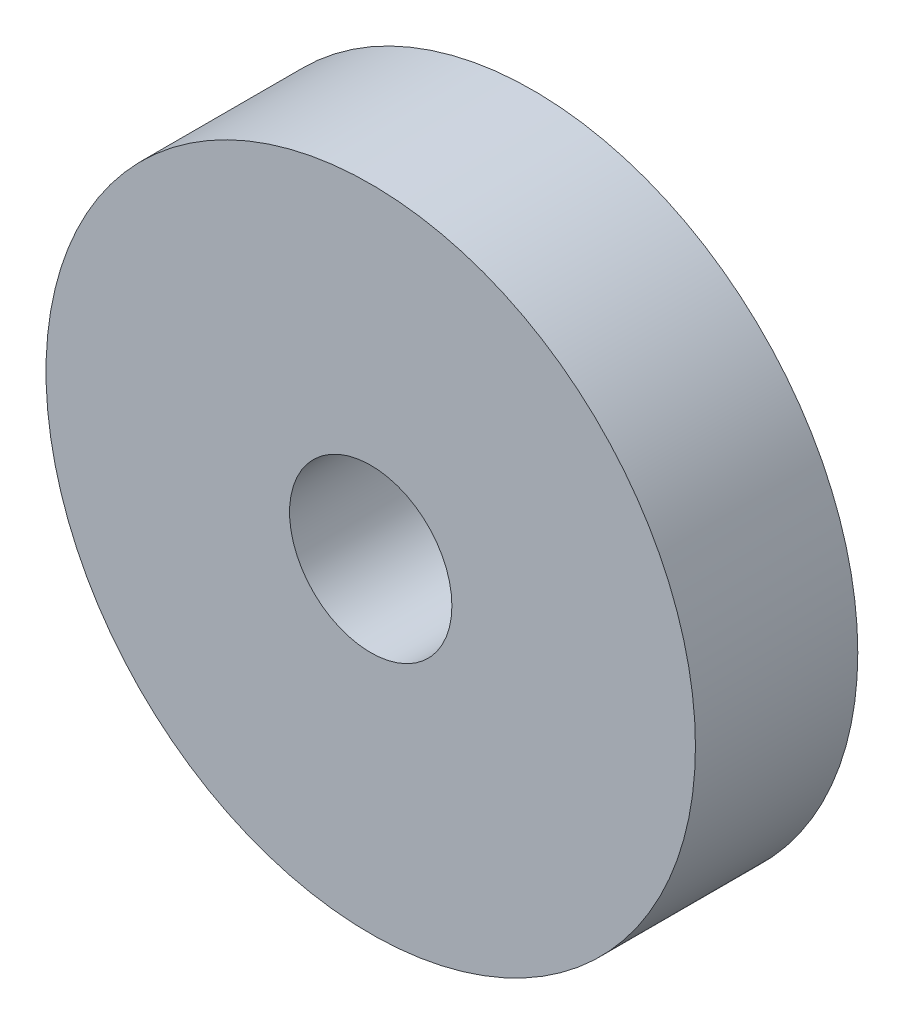
ISO-10303-21;
HEADER;
FILE_DESCRIPTION(('STEP AP214'),'2;1');
FILE_NAME('part.step','',(''),(''),'','','');
FILE_SCHEMA(('AUTOMOTIVE_DESIGN { 1 0 10303 214 1 1 1 1 }'));
ENDSEC;
DATA;
#1=APPLICATION_CONTEXT('core data for automotive mechanical design processes');
#2=APPLICATION_PROTOCOL_DEFINITION('international standard','automotive_design',2000,#1);
#3=PRODUCT_CONTEXT('',#1,'mechanical');
#4=PRODUCT('Part','Part','',(#3));
#5=PRODUCT_RELATED_PRODUCT_CATEGORY('part','',(#4));
#6=PRODUCT_DEFINITION_FORMATION('','',#4);
#7=PRODUCT_DEFINITION_CONTEXT('part definition',#1,'design');
#8=PRODUCT_DEFINITION('design','',#6,#7);
#9=PRODUCT_DEFINITION_SHAPE('','',#8);
#10=(LENGTH_UNIT() NAMED_UNIT(*) SI_UNIT(.MILLI.,.METRE.));
#11=(NAMED_UNIT(*) PLANE_ANGLE_UNIT() SI_UNIT($,.RADIAN.));
#12=(NAMED_UNIT(*) SI_UNIT($,.STERADIAN.) SOLID_ANGLE_UNIT());
#13=UNCERTAINTY_MEASURE_WITH_UNIT(LENGTH_MEASURE(1.E-05),#10,'distance_accuracy_value','');
#14=(GEOMETRIC_REPRESENTATION_CONTEXT(3) GLOBAL_UNCERTAINTY_ASSIGNED_CONTEXT((#13)) GLOBAL_UNIT_ASSIGNED_CONTEXT((#10,
#11,#12)) REPRESENTATION_CONTEXT('',''));
#15=CARTESIAN_POINT('',(0.,0.,0.));
#16=DIRECTION('',(0.,0.,1.));
#17=DIRECTION('',(1.,0.,0.));
#18=AXIS2_PLACEMENT_3D('',#15,#16,#17);
#19=CARTESIAN_POINT('',(0.,0.,5.));
#20=DIRECTION('',(0.,0.,1.));
#21=DIRECTION('',(1.,0.,0.));
#22=AXIS2_PLACEMENT_3D('',#19,#20,#21);
#23=PLANE('',#22);
#24=CARTESIAN_POINT('',(0.,0.,5.));
#25=DIRECTION('',(0.,0.,1.));
#26=DIRECTION('',(1.,0.,0.));
#27=AXIS2_PLACEMENT_3D('',#24,#25,#26);
#28=CIRCLE('',#27,10.);
#29=CARTESIAN_POINT('',(10.,0.,5.));
#30=VERTEX_POINT('',#29);
#31=EDGE_CURVE('E10',#30,#30,#28,.T.);
#32=ORIENTED_EDGE('',*,*,#31,.T.);
#33=EDGE_LOOP('',(#32));
#34=FACE_BOUND('',#33,.T.);
#35=CARTESIAN_POINT('',(0.,0.,5.));
#36=DIRECTION('',(0.,0.,1.));
#37=DIRECTION('',(1.,0.,0.));
#38=AXIS2_PLACEMENT_3D('',#35,#36,#37);
#39=CIRCLE('',#38,2.5);
#40=CARTESIAN_POINT('',(2.5,0.,5.));
#41=VERTEX_POINT('',#40);
#42=EDGE_CURVE('E50',#41,#41,#39,.T.);
#43=ORIENTED_EDGE('',*,*,#42,.F.);
#44=EDGE_LOOP('',(#43));
#45=FACE_BOUND('',#44,.T.);
#46=ADVANCED_FACE('F39',(#34,#45),#23,.T.);
#47=CARTESIAN_POINT('',(0.,0.,0.));
#48=DIRECTION('',(0.,0.,1.));
#49=DIRECTION('',(1.,0.,0.));
#50=AXIS2_PLACEMENT_3D('',#47,#48,#49);
#51=PLANE('',#50);
#52=CARTESIAN_POINT('',(0.,0.,0.));
#53=DIRECTION('',(0.,0.,1.));
#54=DIRECTION('',(1.,0.,0.));
#55=AXIS2_PLACEMENT_3D('',#52,#53,#54);
#56=CIRCLE('',#55,10.);
#57=CARTESIAN_POINT('',(10.,0.,0.));
#58=VERTEX_POINT('',#57);
#59=EDGE_CURVE('E43',#58,#58,#56,.T.);
#60=ORIENTED_EDGE('',*,*,#59,.F.);
#61=EDGE_LOOP('',(#60));
#62=FACE_BOUND('',#61,.T.);
#63=CARTESIAN_POINT('',(0.,0.,0.));
#64=DIRECTION('',(0.,0.,1.));
#65=DIRECTION('',(1.,0.,0.));
#66=AXIS2_PLACEMENT_3D('',#63,#64,#65);
#67=CIRCLE('',#66,2.5);
#68=CARTESIAN_POINT('',(2.5,0.,0.));
#69=VERTEX_POINT('',#68);
#70=EDGE_CURVE('E52',#69,#69,#67,.T.);
#71=ORIENTED_EDGE('',*,*,#70,.T.);
#72=EDGE_LOOP('',(#71));
#73=FACE_BOUND('',#72,.T.);
#74=ADVANCED_FACE('F62',(#62,#73),#51,.F.);
#75=CARTESIAN_POINT('',(0.,0.,5.));
#76=DIRECTION('',(0.,0.,-1.));
#77=DIRECTION('',(-1.,0.,0.));
#78=AXIS2_PLACEMENT_3D('',#75,#76,#77);
#79=CYLINDRICAL_SURFACE('',#78,10.);
#80=ORIENTED_EDGE('',*,*,#31,.F.);
#81=EDGE_LOOP('',(#80));
#82=FACE_BOUND('',#81,.T.);
#83=ORIENTED_EDGE('',*,*,#59,.T.);
#84=EDGE_LOOP('',(#83));
#85=FACE_BOUND('',#84,.T.);
#86=ADVANCED_FACE('F41',(#82,#85),#79,.T.);
#87=CARTESIAN_POINT('',(0.,0.,5.));
#88=DIRECTION('',(0.,0.,-1.));
#89=DIRECTION('',(-1.,0.,0.));
#90=AXIS2_PLACEMENT_3D('',#87,#88,#89);
#91=CYLINDRICAL_SURFACE('',#90,2.5);
#92=ORIENTED_EDGE('',*,*,#42,.T.);
#93=EDGE_LOOP('',(#92));
#94=FACE_BOUND('',#93,.T.);
#95=ORIENTED_EDGE('',*,*,#70,.F.);
#96=EDGE_LOOP('',(#95));
#97=FACE_BOUND('',#96,.T.);
#98=ADVANCED_FACE('F58',(#94,#97),#91,.F.);
#99=CLOSED_SHELL('',(#46,#74,#86,#98));
#100=MANIFOLD_SOLID_BREP('B2',#99);
#101=ADVANCED_BREP_SHAPE_REPRESENTATION('',(#18,#100),#14);
#102=SHAPE_DEFINITION_REPRESENTATION(#9,#101);
ENDSEC;
END-ISO-10303-21;
